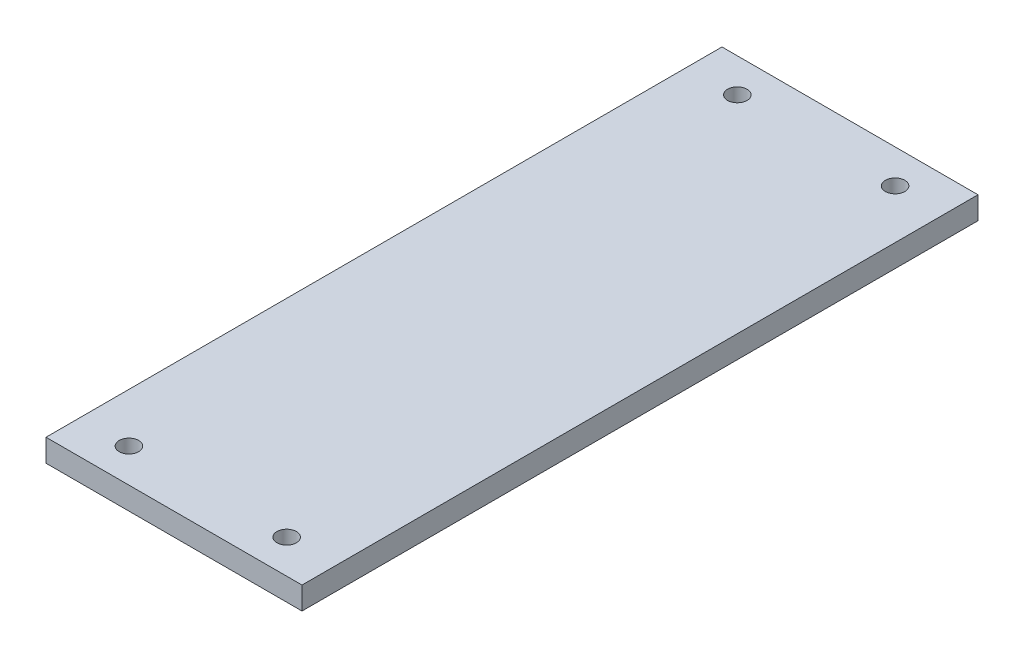
ISO-10303-21;
HEADER;
FILE_DESCRIPTION(('STEP AP214'),'2;1');
FILE_NAME('part.step','',(''),(''),'','','');
FILE_SCHEMA(('AUTOMOTIVE_DESIGN { 1 0 10303 214 1 1 1 1 }'));
ENDSEC;
DATA;
#1=APPLICATION_CONTEXT('core data for automotive mechanical design processes');
#2=APPLICATION_PROTOCOL_DEFINITION('international standard','automotive_design',2000,#1);
#3=PRODUCT_CONTEXT('',#1,'mechanical');
#4=PRODUCT('Part','Part','',(#3));
#5=PRODUCT_RELATED_PRODUCT_CATEGORY('part','',(#4));
#6=PRODUCT_DEFINITION_FORMATION('','',#4);
#7=PRODUCT_DEFINITION_CONTEXT('part definition',#1,'design');
#8=PRODUCT_DEFINITION('design','',#6,#7);
#9=PRODUCT_DEFINITION_SHAPE('','',#8);
#10=(LENGTH_UNIT() NAMED_UNIT(*) SI_UNIT(.MILLI.,.METRE.));
#11=(NAMED_UNIT(*) PLANE_ANGLE_UNIT() SI_UNIT($,.RADIAN.));
#12=(NAMED_UNIT(*) SI_UNIT($,.STERADIAN.) SOLID_ANGLE_UNIT());
#13=UNCERTAINTY_MEASURE_WITH_UNIT(LENGTH_MEASURE(1.E-05),#10,'distance_accuracy_value','');
#14=(GEOMETRIC_REPRESENTATION_CONTEXT(3) GLOBAL_UNCERTAINTY_ASSIGNED_CONTEXT((#13)) GLOBAL_UNIT_ASSIGNED_CONTEXT((#10,
#11,#12)) REPRESENTATION_CONTEXT('',''));
#15=CARTESIAN_POINT('',(0.,0.,0.));
#16=DIRECTION('',(0.,0.,1.));
#17=DIRECTION('',(1.,0.,0.));
#18=AXIS2_PLACEMENT_3D('',#15,#16,#17);
#19=CARTESIAN_POINT('',(36.071859276,6.35,95.25));
#20=DIRECTION('',(-1.,0.,0.));
#21=DIRECTION('',(0.,0.,1.));
#22=AXIS2_PLACEMENT_3D('',#19,#20,#21);
#23=PLANE('',#22);
#24=DIRECTION('',(0.,0.,-1.));
#25=VECTOR('',#24,1.);
#26=CARTESIAN_POINT('',(36.071859276,0.,95.25));
#27=LINE('',#26,#25);
#28=CARTESIAN_POINT('',(36.071859276,0.,95.25));
#29=VERTEX_POINT('',#28);
#30=CARTESIAN_POINT('',(36.071859276,0.,-95.25));
#31=VERTEX_POINT('',#30);
#32=EDGE_CURVE('E111',#29,#31,#27,.T.);
#33=ORIENTED_EDGE('',*,*,#32,.T.);
#34=DIRECTION('',(0.,-1.,0.));
#35=VECTOR('',#34,1.);
#36=CARTESIAN_POINT('',(36.071859276,6.35,-95.25));
#37=LINE('',#36,#35);
#38=CARTESIAN_POINT('',(36.071859276,6.35,-95.25));
#39=VERTEX_POINT('',#38);
#40=EDGE_CURVE('E11',#39,#31,#37,.T.);
#41=ORIENTED_EDGE('',*,*,#40,.F.);
#42=DIRECTION('',(0.,0.,-1.));
#43=VECTOR('',#42,1.);
#44=CARTESIAN_POINT('',(36.071859276,6.35,95.25));
#45=LINE('',#44,#43);
#46=CARTESIAN_POINT('',(36.071859276,6.35,95.25));
#47=VERTEX_POINT('',#46);
#48=EDGE_CURVE('E95',#47,#39,#45,.T.);
#49=ORIENTED_EDGE('',*,*,#48,.F.);
#50=DIRECTION('',(0.,-1.,0.));
#51=VECTOR('',#50,1.);
#52=CARTESIAN_POINT('',(36.071859276,6.35,95.25));
#53=LINE('',#52,#51);
#54=EDGE_CURVE('E107',#47,#29,#53,.T.);
#55=ORIENTED_EDGE('',*,*,#54,.T.);
#56=EDGE_LOOP('',(#33,#41,#49,#55));
#57=FACE_BOUND('',#56,.T.);
#58=ADVANCED_FACE('F43',(#57),#23,.F.);
#59=CARTESIAN_POINT('',(-36.071859276,6.35,-95.25));
#60=DIRECTION('',(0.,0.,1.));
#61=DIRECTION('',(1.,0.,0.));
#62=AXIS2_PLACEMENT_3D('',#59,#60,#61);
#63=PLANE('',#62);
#64=DIRECTION('',(-1.,0.,0.));
#65=VECTOR('',#64,1.);
#66=CARTESIAN_POINT('',(-36.071859276,0.,-95.25));
#67=LINE('',#66,#65);
#68=CARTESIAN_POINT('',(-36.071859276,0.,-95.25));
#69=VERTEX_POINT('',#68);
#70=EDGE_CURVE('E100',#31,#69,#67,.T.);
#71=ORIENTED_EDGE('',*,*,#70,.T.);
#72=DIRECTION('',(0.,-1.,0.));
#73=VECTOR('',#72,1.);
#74=CARTESIAN_POINT('',(-36.071859276,6.35,-95.25));
#75=LINE('',#74,#73);
#76=CARTESIAN_POINT('',(-36.071859276,6.35,-95.25));
#77=VERTEX_POINT('',#76);
#78=EDGE_CURVE('E52',#77,#69,#75,.T.);
#79=ORIENTED_EDGE('',*,*,#78,.F.);
#80=DIRECTION('',(-1.,0.,0.));
#81=VECTOR('',#80,1.);
#82=CARTESIAN_POINT('',(-36.071859276,6.35,-95.25));
#83=LINE('',#82,#81);
#84=EDGE_CURVE('E90',#39,#77,#83,.T.);
#85=ORIENTED_EDGE('',*,*,#84,.F.);
#86=ORIENTED_EDGE('',*,*,#40,.T.);
#87=EDGE_LOOP('',(#71,#79,#85,#86));
#88=FACE_BOUND('',#87,.T.);
#89=ADVANCED_FACE('F99',(#88),#63,.F.);
#90=CARTESIAN_POINT('',(-36.071859276,6.35,95.25));
#91=DIRECTION('',(1.,0.,0.));
#92=DIRECTION('',(0.,0.,-1.));
#93=AXIS2_PLACEMENT_3D('',#90,#91,#92);
#94=PLANE('',#93);
#95=DIRECTION('',(0.,0.,1.));
#96=VECTOR('',#95,1.);
#97=CARTESIAN_POINT('',(-36.071859276,0.,95.25));
#98=LINE('',#97,#96);
#99=CARTESIAN_POINT('',(-36.071859276,0.,95.25));
#100=VERTEX_POINT('',#99);
#101=EDGE_CURVE('E77',#69,#100,#98,.T.);
#102=ORIENTED_EDGE('',*,*,#101,.T.);
#103=DIRECTION('',(0.,-1.,0.));
#104=VECTOR('',#103,1.);
#105=CARTESIAN_POINT('',(-36.071859276,6.35,95.25));
#106=LINE('',#105,#104);
#107=CARTESIAN_POINT('',(-36.071859276,6.35,95.25));
#108=VERTEX_POINT('',#107);
#109=EDGE_CURVE('E102',#108,#100,#106,.T.);
#110=ORIENTED_EDGE('',*,*,#109,.F.);
#111=DIRECTION('',(0.,0.,1.));
#112=VECTOR('',#111,1.);
#113=CARTESIAN_POINT('',(-36.071859276,6.35,95.25));
#114=LINE('',#113,#112);
#115=EDGE_CURVE('E93',#77,#108,#114,.T.);
#116=ORIENTED_EDGE('',*,*,#115,.F.);
#117=ORIENTED_EDGE('',*,*,#78,.T.);
#118=EDGE_LOOP('',(#102,#110,#116,#117));
#119=FACE_BOUND('',#118,.T.);
#120=ADVANCED_FACE('F103',(#119),#94,.F.);
#121=CARTESIAN_POINT('',(-36.071859276,6.35,95.25));
#122=DIRECTION('',(0.,0.,-1.));
#123=DIRECTION('',(-1.,0.,0.));
#124=AXIS2_PLACEMENT_3D('',#121,#122,#123);
#125=PLANE('',#124);
#126=DIRECTION('',(1.,0.,0.));
#127=VECTOR('',#126,1.);
#128=CARTESIAN_POINT('',(-36.071859276,0.,95.25));
#129=LINE('',#128,#127);
#130=EDGE_CURVE('E83',#100,#29,#129,.T.);
#131=ORIENTED_EDGE('',*,*,#130,.T.);
#132=ORIENTED_EDGE('',*,*,#54,.F.);
#133=DIRECTION('',(1.,0.,0.));
#134=VECTOR('',#133,1.);
#135=CARTESIAN_POINT('',(-36.071859276,6.35,95.25));
#136=LINE('',#135,#134);
#137=EDGE_CURVE('E60',#108,#47,#136,.T.);
#138=ORIENTED_EDGE('',*,*,#137,.F.);
#139=ORIENTED_EDGE('',*,*,#109,.T.);
#140=EDGE_LOOP('',(#131,#132,#138,#139));
#141=FACE_BOUND('',#140,.T.);
#142=ADVANCED_FACE('F125',(#141),#125,.F.);
#143=CARTESIAN_POINT('',(0.,6.35,0.));
#144=DIRECTION('',(0.,-1.,0.));
#145=DIRECTION('',(0.,0.,-1.));
#146=AXIS2_PLACEMENT_3D('',#143,#144,#145);
#147=PLANE('',#146);
#148=CARTESIAN_POINT('',(-22.225,6.35,85.725));
#149=DIRECTION('',(0.,1.,0.));
#150=DIRECTION('',(0.,0.,-1.));
#151=AXIS2_PLACEMENT_3D('',#148,#149,#150);
#152=CIRCLE('',#151,2.75);
#153=CARTESIAN_POINT('',(-22.225,6.35,82.975));
#154=VERTEX_POINT('',#153);
#155=EDGE_CURVE('E140',#154,#154,#152,.T.);
#156=ORIENTED_EDGE('',*,*,#155,.F.);
#157=EDGE_LOOP('',(#156));
#158=FACE_BOUND('',#157,.T.);
#159=CARTESIAN_POINT('',(22.225,6.35,85.725));
#160=DIRECTION('',(0.,1.,0.));
#161=DIRECTION('',(0.,0.,1.));
#162=AXIS2_PLACEMENT_3D('',#159,#160,#161);
#163=CIRCLE('',#162,2.75);
#164=CARTESIAN_POINT('',(22.225,6.35,88.475));
#165=VERTEX_POINT('',#164);
#166=EDGE_CURVE('E148',#165,#165,#163,.T.);
#167=ORIENTED_EDGE('',*,*,#166,.F.);
#168=EDGE_LOOP('',(#167));
#169=FACE_BOUND('',#168,.T.);
#170=CARTESIAN_POINT('',(22.225,6.35,-85.725));
#171=DIRECTION('',(0.,1.,0.));
#172=DIRECTION('',(0.,0.,-1.));
#173=AXIS2_PLACEMENT_3D('',#170,#171,#172);
#174=CIRCLE('',#173,2.75);
#175=CARTESIAN_POINT('',(22.225,6.35,-88.475));
#176=VERTEX_POINT('',#175);
#177=EDGE_CURVE('E156',#176,#176,#174,.T.);
#178=ORIENTED_EDGE('',*,*,#177,.F.);
#179=EDGE_LOOP('',(#178));
#180=FACE_BOUND('',#179,.T.);
#181=CARTESIAN_POINT('',(-22.225,6.35,-85.725));
#182=DIRECTION('',(0.,1.,0.));
#183=DIRECTION('',(0.,0.,1.));
#184=AXIS2_PLACEMENT_3D('',#181,#182,#183);
#185=CIRCLE('',#184,2.75);
#186=CARTESIAN_POINT('',(-22.225,6.35,-82.975));
#187=VERTEX_POINT('',#186);
#188=EDGE_CURVE('E132',#187,#187,#185,.T.);
#189=ORIENTED_EDGE('',*,*,#188,.F.);
#190=EDGE_LOOP('',(#189));
#191=FACE_BOUND('',#190,.T.);
#192=ORIENTED_EDGE('',*,*,#48,.T.);
#193=ORIENTED_EDGE('',*,*,#84,.T.);
#194=ORIENTED_EDGE('',*,*,#115,.T.);
#195=ORIENTED_EDGE('',*,*,#137,.T.);
#196=EDGE_LOOP('',(#192,#193,#194,#195));
#197=FACE_BOUND('',#196,.T.);
#198=ADVANCED_FACE('F91',(#158,#169,#180,#191,#197),#147,.F.);
#199=CARTESIAN_POINT('',(0.,0.,0.));
#200=DIRECTION('',(0.,-1.,0.));
#201=DIRECTION('',(0.,0.,-1.));
#202=AXIS2_PLACEMENT_3D('',#199,#200,#201);
#203=PLANE('',#202);
#204=CARTESIAN_POINT('',(-22.225,0.,85.725));
#205=DIRECTION('',(0.,1.,0.));
#206=DIRECTION('',(0.,0.,-1.));
#207=AXIS2_PLACEMENT_3D('',#204,#205,#206);
#208=CIRCLE('',#207,2.75);
#209=CARTESIAN_POINT('',(-22.225,0.,82.975));
#210=VERTEX_POINT('',#209);
#211=EDGE_CURVE('E144',#210,#210,#208,.T.);
#212=ORIENTED_EDGE('',*,*,#211,.T.);
#213=EDGE_LOOP('',(#212));
#214=FACE_BOUND('',#213,.T.);
#215=CARTESIAN_POINT('',(22.225,0.,85.725));
#216=DIRECTION('',(0.,1.,0.));
#217=DIRECTION('',(0.,0.,1.));
#218=AXIS2_PLACEMENT_3D('',#215,#216,#217);
#219=CIRCLE('',#218,2.75);
#220=CARTESIAN_POINT('',(22.225,0.,88.475));
#221=VERTEX_POINT('',#220);
#222=EDGE_CURVE('E152',#221,#221,#219,.T.);
#223=ORIENTED_EDGE('',*,*,#222,.T.);
#224=EDGE_LOOP('',(#223));
#225=FACE_BOUND('',#224,.T.);
#226=CARTESIAN_POINT('',(22.225,0.,-85.725));
#227=DIRECTION('',(0.,1.,0.));
#228=DIRECTION('',(0.,0.,-1.));
#229=AXIS2_PLACEMENT_3D('',#226,#227,#228);
#230=CIRCLE('',#229,2.75);
#231=CARTESIAN_POINT('',(22.225,0.,-88.475));
#232=VERTEX_POINT('',#231);
#233=EDGE_CURVE('E136',#232,#232,#230,.T.);
#234=ORIENTED_EDGE('',*,*,#233,.T.);
#235=EDGE_LOOP('',(#234));
#236=FACE_BOUND('',#235,.T.);
#237=CARTESIAN_POINT('',(-22.225,0.,-85.725));
#238=DIRECTION('',(0.,1.,0.));
#239=DIRECTION('',(0.,0.,1.));
#240=AXIS2_PLACEMENT_3D('',#237,#238,#239);
#241=CIRCLE('',#240,2.75);
#242=CARTESIAN_POINT('',(-22.225,0.,-82.975));
#243=VERTEX_POINT('',#242);
#244=EDGE_CURVE('E115',#243,#243,#241,.T.);
#245=ORIENTED_EDGE('',*,*,#244,.T.);
#246=EDGE_LOOP('',(#245));
#247=FACE_BOUND('',#246,.T.);
#248=ORIENTED_EDGE('',*,*,#32,.F.);
#249=ORIENTED_EDGE('',*,*,#130,.F.);
#250=ORIENTED_EDGE('',*,*,#101,.F.);
#251=ORIENTED_EDGE('',*,*,#70,.F.);
#252=EDGE_LOOP('',(#248,#249,#250,#251));
#253=FACE_BOUND('',#252,.T.);
#254=ADVANCED_FACE('F128',(#214,#225,#236,#247,#253),#203,.T.);
#255=CARTESIAN_POINT('',(-22.225,0.,-85.725));
#256=DIRECTION('',(0.,1.,0.));
#257=DIRECTION('',(0.,0.,1.));
#258=AXIS2_PLACEMENT_3D('',#255,#256,#257);
#259=CYLINDRICAL_SURFACE('',#258,2.75);
#260=ORIENTED_EDGE('',*,*,#244,.F.);
#261=EDGE_LOOP('',(#260));
#262=FACE_BOUND('',#261,.T.);
#263=ORIENTED_EDGE('',*,*,#188,.T.);
#264=EDGE_LOOP('',(#263));
#265=FACE_BOUND('',#264,.T.);
#266=ADVANCED_FACE('F170',(#262,#265),#259,.F.);
#267=CARTESIAN_POINT('',(22.225,0.,-85.725));
#268=DIRECTION('',(0.,1.,0.));
#269=DIRECTION('',(0.,0.,1.));
#270=AXIS2_PLACEMENT_3D('',#267,#268,#269);
#271=CYLINDRICAL_SURFACE('',#270,2.75);
#272=ORIENTED_EDGE('',*,*,#233,.F.);
#273=EDGE_LOOP('',(#272));
#274=FACE_BOUND('',#273,.T.);
#275=ORIENTED_EDGE('',*,*,#177,.T.);
#276=EDGE_LOOP('',(#275));
#277=FACE_BOUND('',#276,.T.);
#278=ADVANCED_FACE('F166',(#274,#277),#271,.F.);
#279=CARTESIAN_POINT('',(22.225,0.,85.725));
#280=DIRECTION('',(0.,1.,0.));
#281=DIRECTION('',(0.,0.,1.));
#282=AXIS2_PLACEMENT_3D('',#279,#280,#281);
#283=CYLINDRICAL_SURFACE('',#282,2.75);
#284=ORIENTED_EDGE('',*,*,#222,.F.);
#285=EDGE_LOOP('',(#284));
#286=FACE_BOUND('',#285,.T.);
#287=ORIENTED_EDGE('',*,*,#166,.T.);
#288=EDGE_LOOP('',(#287));
#289=FACE_BOUND('',#288,.T.);
#290=ADVANCED_FACE('F169',(#286,#289),#283,.F.);
#291=CARTESIAN_POINT('',(-22.225,0.,85.725));
#292=DIRECTION('',(0.,1.,0.));
#293=DIRECTION('',(0.,0.,1.));
#294=AXIS2_PLACEMENT_3D('',#291,#292,#293);
#295=CYLINDRICAL_SURFACE('',#294,2.75);
#296=ORIENTED_EDGE('',*,*,#211,.F.);
#297=EDGE_LOOP('',(#296));
#298=FACE_BOUND('',#297,.T.);
#299=ORIENTED_EDGE('',*,*,#155,.T.);
#300=EDGE_LOOP('',(#299));
#301=FACE_BOUND('',#300,.T.);
#302=ADVANCED_FACE('F234',(#298,#301),#295,.F.);
#303=CLOSED_SHELL('',(#58,#89,#120,#142,#198,#254,#266,#278,#290,#302));
#304=MANIFOLD_SOLID_BREP('B2',#303);
#305=ADVANCED_BREP_SHAPE_REPRESENTATION('',(#18,#304),#14);
#306=SHAPE_DEFINITION_REPRESENTATION(#9,#305);
ENDSEC;
END-ISO-10303-21;
